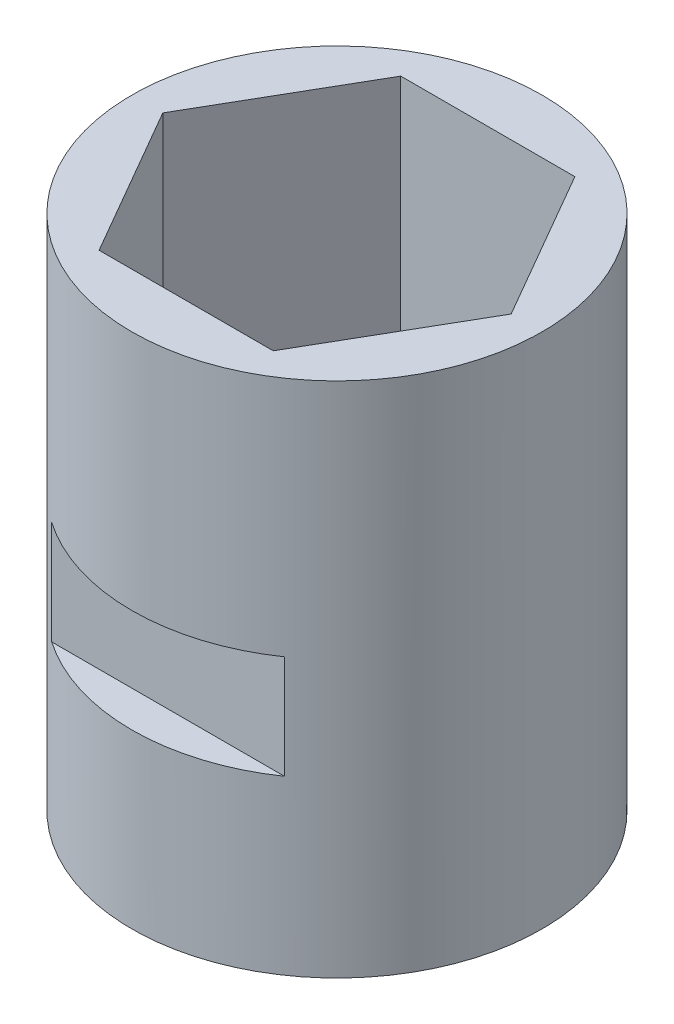
ISO-10303-21;
HEADER;
FILE_DESCRIPTION(('STEP AP214'),'2;1');
FILE_NAME('part.step','',(''),(''),'','','');
FILE_SCHEMA(('AUTOMOTIVE_DESIGN { 1 0 10303 214 1 1 1 1 }'));
ENDSEC;
DATA;
#1=APPLICATION_CONTEXT('core data for automotive mechanical design processes');
#2=APPLICATION_PROTOCOL_DEFINITION('international standard','automotive_design',2000,#1);
#3=PRODUCT_CONTEXT('',#1,'mechanical');
#4=PRODUCT('Part','Part','',(#3));
#5=PRODUCT_RELATED_PRODUCT_CATEGORY('part','',(#4));
#6=PRODUCT_DEFINITION_FORMATION('','',#4);
#7=PRODUCT_DEFINITION_CONTEXT('part definition',#1,'design');
#8=PRODUCT_DEFINITION('design','',#6,#7);
#9=PRODUCT_DEFINITION_SHAPE('','',#8);
#10=(LENGTH_UNIT() NAMED_UNIT(*) SI_UNIT(.MILLI.,.METRE.));
#11=(NAMED_UNIT(*) PLANE_ANGLE_UNIT() SI_UNIT($,.RADIAN.));
#12=(NAMED_UNIT(*) SI_UNIT($,.STERADIAN.) SOLID_ANGLE_UNIT());
#13=UNCERTAINTY_MEASURE_WITH_UNIT(LENGTH_MEASURE(1.E-05),#10,'distance_accuracy_value','');
#14=(GEOMETRIC_REPRESENTATION_CONTEXT(3) GLOBAL_UNCERTAINTY_ASSIGNED_CONTEXT((#13)) GLOBAL_UNIT_ASSIGNED_CONTEXT((#10,
#11,#12)) REPRESENTATION_CONTEXT('',''));
#15=CARTESIAN_POINT('',(0.,0.,0.));
#16=DIRECTION('',(0.,0.,1.));
#17=DIRECTION('',(1.,0.,0.));
#18=AXIS2_PLACEMENT_3D('',#15,#16,#17);
#19=CARTESIAN_POINT('',(0.,15.875,0.));
#20=DIRECTION('',(0.,1.,0.));
#21=DIRECTION('',(0.,0.,1.));
#22=AXIS2_PLACEMENT_3D('',#19,#20,#21);
#23=PLANE('',#22);
#24=CARTESIAN_POINT('',(0.,15.875,0.));
#25=DIRECTION('',(0.,1.,0.));
#26=DIRECTION('',(0.,0.,1.));
#27=AXIS2_PLACEMENT_3D('',#24,#25,#26);
#28=CIRCLE('',#27,7.5565);
#29=CARTESIAN_POINT('',(0.,15.875,7.5565));
#30=VERTEX_POINT('',#29);
#31=EDGE_CURVE('E200',#30,#30,#28,.T.);
#32=ORIENTED_EDGE('',*,*,#31,.T.);
#33=EDGE_LOOP('',(#32));
#34=FACE_BOUND('',#33,.T.);
#35=DIRECTION('',(-0.5,0.,0.866025403784439));
#36=VECTOR('',#35,1.);
#37=CARTESIAN_POINT('',(-3.20790243318486,15.875,-5.55625));
#38=LINE('',#37,#36);
#39=CARTESIAN_POINT('',(-3.20790243318486,15.875,-5.55625));
#40=VERTEX_POINT('',#39);
#41=CARTESIAN_POINT('',(-6.41580486636972,15.875,0.));
#42=VERTEX_POINT('',#41);
#43=EDGE_CURVE('E159',#40,#42,#38,.T.);
#44=ORIENTED_EDGE('',*,*,#43,.F.);
#45=DIRECTION('',(-1.,0.,0.));
#46=VECTOR('',#45,1.);
#47=CARTESIAN_POINT('',(3.20790243318486,15.875,-5.55625));
#48=LINE('',#47,#46);
#49=CARTESIAN_POINT('',(3.20790243318486,15.875,-5.55625));
#50=VERTEX_POINT('',#49);
#51=EDGE_CURVE('E157',#50,#40,#48,.T.);
#52=ORIENTED_EDGE('',*,*,#51,.F.);
#53=DIRECTION('',(-0.5,0.,-0.866025403784439));
#54=VECTOR('',#53,1.);
#55=CARTESIAN_POINT('',(6.41580486636972,15.875,0.));
#56=LINE('',#55,#54);
#57=CARTESIAN_POINT('',(6.41580486636972,15.875,0.));
#58=VERTEX_POINT('',#57);
#59=EDGE_CURVE('E169',#58,#50,#56,.T.);
#60=ORIENTED_EDGE('',*,*,#59,.F.);
#61=DIRECTION('',(0.5,0.,-0.866025403784439));
#62=VECTOR('',#61,1.);
#63=CARTESIAN_POINT('',(3.20790243318486,15.875,5.55625));
#64=LINE('',#63,#62);
#65=CARTESIAN_POINT('',(3.20790243318486,15.875,5.55625));
#66=VERTEX_POINT('',#65);
#67=EDGE_CURVE('E166',#66,#58,#64,.T.);
#68=ORIENTED_EDGE('',*,*,#67,.F.);
#69=DIRECTION('',(1.,0.,0.));
#70=VECTOR('',#69,1.);
#71=CARTESIAN_POINT('',(-3.20790243318486,15.875,5.55625));
#72=LINE('',#71,#70);
#73=CARTESIAN_POINT('',(-3.20790243318486,15.875,5.55625));
#74=VERTEX_POINT('',#73);
#75=EDGE_CURVE('E164',#74,#66,#72,.T.);
#76=ORIENTED_EDGE('',*,*,#75,.F.);
#77=DIRECTION('',(0.5,0.,0.866025403784439));
#78=VECTOR('',#77,1.);
#79=CARTESIAN_POINT('',(-6.41580486636972,15.875,0.));
#80=LINE('',#79,#78);
#81=EDGE_CURVE('E162',#42,#74,#80,.T.);
#82=ORIENTED_EDGE('',*,*,#81,.F.);
#83=EDGE_LOOP('',(#44,#52,#60,#68,#76,#82));
#84=FACE_BOUND('',#83,.T.);
#85=ADVANCED_FACE('F34',(#34,#84),#23,.T.);
#86=CARTESIAN_POINT('',(0.,15.875,0.));
#87=DIRECTION('',(0.,-1.,0.));
#88=DIRECTION('',(0.,0.,-1.));
#89=AXIS2_PLACEMENT_3D('',#86,#87,#88);
#90=CYLINDRICAL_SURFACE('',#89,7.5565);
#91=DIRECTION('',(0.,-1.,0.));
#92=VECTOR('',#91,1.);
#93=CARTESIAN_POINT('',(-4.28660276326136,15.875,6.22300000000001));
#94=LINE('',#93,#92);
#95=CARTESIAN_POINT('',(-4.28660276326137,3.175,6.223));
#96=VERTEX_POINT('',#95);
#97=CARTESIAN_POINT('',(-4.28660276326136,6.985,6.223));
#98=VERTEX_POINT('',#97);
#99=EDGE_CURVE('E129',#96,#98,#94,.F.);
#100=ORIENTED_EDGE('',*,*,#99,.T.);
#101=CARTESIAN_POINT('',(0.,6.985,0.));
#102=DIRECTION('',(0.,1.,0.));
#103=DIRECTION('',(0.,0.,1.));
#104=AXIS2_PLACEMENT_3D('',#101,#102,#103);
#105=CIRCLE('',#104,7.5565);
#106=CARTESIAN_POINT('',(4.28660276326136,6.985,6.223));
#107=VERTEX_POINT('',#106);
#108=EDGE_CURVE('E11',#98,#107,#105,.T.);
#109=ORIENTED_EDGE('',*,*,#108,.T.);
#110=DIRECTION('',(0.,-1.,0.));
#111=VECTOR('',#110,1.);
#112=CARTESIAN_POINT('',(4.28660276326136,15.875,6.22300000000001));
#113=LINE('',#112,#111);
#114=CARTESIAN_POINT('',(4.28660276326137,3.175,6.223));
#115=VERTEX_POINT('',#114);
#116=EDGE_CURVE('E42',#107,#115,#113,.T.);
#117=ORIENTED_EDGE('',*,*,#116,.T.);
#118=CARTESIAN_POINT('',(0.,3.175,0.));
#119=DIRECTION('',(0.,-1.,0.));
#120=DIRECTION('',(0.,0.,-1.));
#121=AXIS2_PLACEMENT_3D('',#118,#119,#120);
#122=CIRCLE('',#121,7.5565);
#123=EDGE_CURVE('E126',#115,#96,#122,.T.);
#124=ORIENTED_EDGE('',*,*,#123,.T.);
#125=EDGE_LOOP('',(#100,#109,#117,#124));
#126=FACE_BOUND('',#125,.T.);
#127=CARTESIAN_POINT('',(0.,6.985,0.));
#128=DIRECTION('',(0.,1.,0.));
#129=DIRECTION('',(0.,0.,1.));
#130=AXIS2_PLACEMENT_3D('',#127,#128,#129);
#131=CIRCLE('',#130,7.5565);
#132=CARTESIAN_POINT('',(4.28660276326137,6.985,-6.223));
#133=VERTEX_POINT('',#132);
#134=CARTESIAN_POINT('',(-4.28660276326137,6.985,-6.223));
#135=VERTEX_POINT('',#134);
#136=EDGE_CURVE('E118',#133,#135,#131,.T.);
#137=ORIENTED_EDGE('',*,*,#136,.T.);
#138=DIRECTION('',(0.,-1.,0.));
#139=VECTOR('',#138,1.);
#140=CARTESIAN_POINT('',(-4.28660276326137,15.875,-6.223));
#141=LINE('',#140,#139);
#142=CARTESIAN_POINT('',(-4.28660276326137,3.175,-6.223));
#143=VERTEX_POINT('',#142);
#144=EDGE_CURVE('E122',#135,#143,#141,.T.);
#145=ORIENTED_EDGE('',*,*,#144,.T.);
#146=CARTESIAN_POINT('',(0.,3.175,0.));
#147=DIRECTION('',(0.,-1.,0.));
#148=DIRECTION('',(0.,0.,-1.));
#149=AXIS2_PLACEMENT_3D('',#146,#147,#148);
#150=CIRCLE('',#149,7.5565);
#151=CARTESIAN_POINT('',(4.28660276326137,3.175,-6.223));
#152=VERTEX_POINT('',#151);
#153=EDGE_CURVE('E111',#143,#152,#150,.T.);
#154=ORIENTED_EDGE('',*,*,#153,.T.);
#155=DIRECTION('',(0.,-1.,0.));
#156=VECTOR('',#155,1.);
#157=CARTESIAN_POINT('',(4.28660276326137,15.875,-6.223));
#158=LINE('',#157,#156);
#159=EDGE_CURVE('E119',#152,#133,#158,.F.);
#160=ORIENTED_EDGE('',*,*,#159,.T.);
#161=EDGE_LOOP('',(#137,#145,#154,#160));
#162=FACE_BOUND('',#161,.T.);
#163=ORIENTED_EDGE('',*,*,#31,.F.);
#164=EDGE_LOOP('',(#163));
#165=FACE_BOUND('',#164,.T.);
#166=CARTESIAN_POINT('',(0.,-3.175,0.));
#167=DIRECTION('',(0.,-1.,0.));
#168=DIRECTION('',(0.,0.,-1.));
#169=AXIS2_PLACEMENT_3D('',#166,#167,#168);
#170=CIRCLE('',#169,7.5565);
#171=CARTESIAN_POINT('',(0.,-3.175,-7.5565));
#172=VERTEX_POINT('',#171);
#173=EDGE_CURVE('E152',#172,#172,#170,.T.);
#174=ORIENTED_EDGE('',*,*,#173,.F.);
#175=EDGE_LOOP('',(#174));
#176=FACE_BOUND('',#175,.T.);
#177=ADVANCED_FACE('F36',(#126,#162,#165,#176),#90,.T.);
#178=CARTESIAN_POINT('',(3.20790243318486,15.875,-5.55625));
#179=DIRECTION('',(0.,0.,1.));
#180=DIRECTION('',(1.,0.,0.));
#181=AXIS2_PLACEMENT_3D('',#178,#179,#180);
#182=PLANE('',#181);
#183=DIRECTION('',(-1.,0.,0.));
#184=VECTOR('',#183,1.);
#185=CARTESIAN_POINT('',(3.20790243318486,0.,-5.55625));
#186=LINE('',#185,#184);
#187=CARTESIAN_POINT('',(3.20790243318486,0.,-5.55625));
#188=VERTEX_POINT('',#187);
#189=CARTESIAN_POINT('',(-3.20790243318486,0.,-5.55625));
#190=VERTEX_POINT('',#189);
#191=EDGE_CURVE('E156',#188,#190,#186,.T.);
#192=ORIENTED_EDGE('',*,*,#191,.F.);
#193=DIRECTION('',(0.,-1.,0.));
#194=VECTOR('',#193,1.);
#195=CARTESIAN_POINT('',(3.20790243318486,15.875,-5.55625));
#196=LINE('',#195,#194);
#197=EDGE_CURVE('E171',#50,#188,#196,.T.);
#198=ORIENTED_EDGE('',*,*,#197,.F.);
#199=ORIENTED_EDGE('',*,*,#51,.T.);
#200=DIRECTION('',(0.,-1.,0.));
#201=VECTOR('',#200,1.);
#202=CARTESIAN_POINT('',(-3.20790243318486,15.875,-5.55625));
#203=LINE('',#202,#201);
#204=EDGE_CURVE('E197',#40,#190,#203,.T.);
#205=ORIENTED_EDGE('',*,*,#204,.T.);
#206=EDGE_LOOP('',(#192,#198,#199,#205));
#207=FACE_BOUND('',#206,.T.);
#208=ADVANCED_FACE('F208',(#207),#182,.T.);
#209=CARTESIAN_POINT('',(-3.20790243318486,15.875,-5.55625));
#210=DIRECTION('',(0.866025403784439,0.,0.5));
#211=DIRECTION('',(0.5,0.,-0.866025403784439));
#212=AXIS2_PLACEMENT_3D('',#209,#210,#211);
#213=PLANE('',#212);
#214=DIRECTION('',(-0.5,0.,0.866025403784439));
#215=VECTOR('',#214,1.);
#216=CARTESIAN_POINT('',(-3.20790243318486,0.,-5.55625));
#217=LINE('',#216,#215);
#218=CARTESIAN_POINT('',(-6.41580486636972,0.,0.));
#219=VERTEX_POINT('',#218);
#220=EDGE_CURVE('E174',#190,#219,#217,.T.);
#221=ORIENTED_EDGE('',*,*,#220,.F.);
#222=ORIENTED_EDGE('',*,*,#204,.F.);
#223=ORIENTED_EDGE('',*,*,#43,.T.);
#224=DIRECTION('',(0.,-1.,0.));
#225=VECTOR('',#224,1.);
#226=CARTESIAN_POINT('',(-6.41580486636972,15.875,0.));
#227=LINE('',#226,#225);
#228=EDGE_CURVE('E195',#42,#219,#227,.T.);
#229=ORIENTED_EDGE('',*,*,#228,.T.);
#230=EDGE_LOOP('',(#221,#222,#223,#229));
#231=FACE_BOUND('',#230,.T.);
#232=ADVANCED_FACE('F240',(#231),#213,.T.);
#233=CARTESIAN_POINT('',(-6.41580486636972,15.875,0.));
#234=DIRECTION('',(0.866025403784439,0.,-0.5));
#235=DIRECTION('',(-0.5,0.,-0.866025403784439));
#236=AXIS2_PLACEMENT_3D('',#233,#234,#235);
#237=PLANE('',#236);
#238=DIRECTION('',(0.5,0.,0.866025403784439));
#239=VECTOR('',#238,1.);
#240=CARTESIAN_POINT('',(-6.41580486636972,0.,0.));
#241=LINE('',#240,#239);
#242=CARTESIAN_POINT('',(-3.20790243318486,0.,5.55625));
#243=VERTEX_POINT('',#242);
#244=EDGE_CURVE('E177',#219,#243,#241,.T.);
#245=ORIENTED_EDGE('',*,*,#244,.F.);
#246=ORIENTED_EDGE('',*,*,#228,.F.);
#247=ORIENTED_EDGE('',*,*,#81,.T.);
#248=DIRECTION('',(0.,-1.,0.));
#249=VECTOR('',#248,1.);
#250=CARTESIAN_POINT('',(-3.20790243318486,15.875,5.55625));
#251=LINE('',#250,#249);
#252=EDGE_CURVE('E193',#74,#243,#251,.T.);
#253=ORIENTED_EDGE('',*,*,#252,.T.);
#254=EDGE_LOOP('',(#245,#246,#247,#253));
#255=FACE_BOUND('',#254,.T.);
#256=ADVANCED_FACE('F248',(#255),#237,.T.);
#257=CARTESIAN_POINT('',(-3.20790243318486,15.875,5.55625));
#258=DIRECTION('',(0.,0.,-1.));
#259=DIRECTION('',(-1.,0.,0.));
#260=AXIS2_PLACEMENT_3D('',#257,#258,#259);
#261=PLANE('',#260);
#262=DIRECTION('',(1.,0.,0.));
#263=VECTOR('',#262,1.);
#264=CARTESIAN_POINT('',(-3.20790243318486,0.,5.55625));
#265=LINE('',#264,#263);
#266=CARTESIAN_POINT('',(3.20790243318486,0.,5.55625));
#267=VERTEX_POINT('',#266);
#268=EDGE_CURVE('E180',#243,#267,#265,.T.);
#269=ORIENTED_EDGE('',*,*,#268,.F.);
#270=ORIENTED_EDGE('',*,*,#252,.F.);
#271=ORIENTED_EDGE('',*,*,#75,.T.);
#272=DIRECTION('',(0.,-1.,0.));
#273=VECTOR('',#272,1.);
#274=CARTESIAN_POINT('',(3.20790243318486,15.875,5.55625));
#275=LINE('',#274,#273);
#276=EDGE_CURVE('E191',#66,#267,#275,.T.);
#277=ORIENTED_EDGE('',*,*,#276,.T.);
#278=EDGE_LOOP('',(#269,#270,#271,#277));
#279=FACE_BOUND('',#278,.T.);
#280=ADVANCED_FACE('F251',(#279),#261,.T.);
#281=CARTESIAN_POINT('',(3.20790243318486,15.875,5.55625));
#282=DIRECTION('',(-0.866025403784439,0.,-0.5));
#283=DIRECTION('',(-0.5,0.,0.866025403784439));
#284=AXIS2_PLACEMENT_3D('',#281,#282,#283);
#285=PLANE('',#284);
#286=DIRECTION('',(0.5,0.,-0.866025403784439));
#287=VECTOR('',#286,1.);
#288=CARTESIAN_POINT('',(3.20790243318486,0.,5.55625));
#289=LINE('',#288,#287);
#290=CARTESIAN_POINT('',(6.41580486636972,0.,0.));
#291=VERTEX_POINT('',#290);
#292=EDGE_CURVE('E183',#267,#291,#289,.T.);
#293=ORIENTED_EDGE('',*,*,#292,.F.);
#294=ORIENTED_EDGE('',*,*,#276,.F.);
#295=ORIENTED_EDGE('',*,*,#67,.T.);
#296=DIRECTION('',(0.,-1.,0.));
#297=VECTOR('',#296,1.);
#298=CARTESIAN_POINT('',(6.41580486636972,15.875,0.));
#299=LINE('',#298,#297);
#300=EDGE_CURVE('E189',#58,#291,#299,.T.);
#301=ORIENTED_EDGE('',*,*,#300,.T.);
#302=EDGE_LOOP('',(#293,#294,#295,#301));
#303=FACE_BOUND('',#302,.T.);
#304=ADVANCED_FACE('F254',(#303),#285,.T.);
#305=CARTESIAN_POINT('',(6.41580486636972,15.875,0.));
#306=DIRECTION('',(-0.866025403784439,0.,0.5));
#307=DIRECTION('',(0.5,0.,0.866025403784439));
#308=AXIS2_PLACEMENT_3D('',#305,#306,#307);
#309=PLANE('',#308);
#310=DIRECTION('',(-0.5,0.,-0.866025403784439));
#311=VECTOR('',#310,1.);
#312=CARTESIAN_POINT('',(6.41580486636972,0.,0.));
#313=LINE('',#312,#311);
#314=EDGE_CURVE('E160',#291,#188,#313,.T.);
#315=ORIENTED_EDGE('',*,*,#314,.F.);
#316=ORIENTED_EDGE('',*,*,#300,.F.);
#317=ORIENTED_EDGE('',*,*,#59,.T.);
#318=ORIENTED_EDGE('',*,*,#197,.T.);
#319=EDGE_LOOP('',(#315,#316,#317,#318));
#320=FACE_BOUND('',#319,.T.);
#321=ADVANCED_FACE('F227',(#320),#309,.T.);
#322=CARTESIAN_POINT('',(0.,0.,0.));
#323=DIRECTION('',(0.,-1.,0.));
#324=DIRECTION('',(0.,0.,-1.));
#325=AXIS2_PLACEMENT_3D('',#322,#323,#324);
#326=PLANE('',#325);
#327=CARTESIAN_POINT('',(0.,0.,0.));
#328=DIRECTION('',(0.,-1.,0.));
#329=DIRECTION('',(0.,0.,-1.));
#330=AXIS2_PLACEMENT_3D('',#327,#328,#329);
#331=CIRCLE('',#330,3.3782);
#332=CARTESIAN_POINT('',(0.,0.,-3.3782));
#333=VERTEX_POINT('',#332);
#334=EDGE_CURVE('E143',#333,#333,#331,.T.);
#335=ORIENTED_EDGE('',*,*,#334,.T.);
#336=EDGE_LOOP('',(#335));
#337=FACE_BOUND('',#336,.T.);
#338=ORIENTED_EDGE('',*,*,#314,.T.);
#339=ORIENTED_EDGE('',*,*,#191,.T.);
#340=ORIENTED_EDGE('',*,*,#220,.T.);
#341=ORIENTED_EDGE('',*,*,#244,.T.);
#342=ORIENTED_EDGE('',*,*,#268,.T.);
#343=ORIENTED_EDGE('',*,*,#292,.T.);
#344=EDGE_LOOP('',(#338,#339,#340,#341,#342,#343));
#345=FACE_BOUND('',#344,.T.);
#346=ADVANCED_FACE('F215',(#337,#345),#326,.F.);
#347=CARTESIAN_POINT('',(0.,-3.175,0.));
#348=DIRECTION('',(0.,-1.,0.));
#349=DIRECTION('',(0.,0.,-1.));
#350=AXIS2_PLACEMENT_3D('',#347,#348,#349);
#351=PLANE('',#350);
#352=ORIENTED_EDGE('',*,*,#173,.T.);
#353=EDGE_LOOP('',(#352));
#354=FACE_BOUND('',#353,.T.);
#355=CARTESIAN_POINT('',(0.,-3.175,0.));
#356=DIRECTION('',(0.,-1.,0.));
#357=DIRECTION('',(0.,0.,-1.));
#358=AXIS2_PLACEMENT_3D('',#355,#356,#357);
#359=CIRCLE('',#358,3.3782);
#360=CARTESIAN_POINT('',(0.,-3.175,-3.3782));
#361=VERTEX_POINT('',#360);
#362=EDGE_CURVE('E146',#361,#361,#359,.T.);
#363=ORIENTED_EDGE('',*,*,#362,.F.);
#364=EDGE_LOOP('',(#363));
#365=FACE_BOUND('',#364,.T.);
#366=ADVANCED_FACE('F211',(#354,#365),#351,.T.);
#367=CARTESIAN_POINT('',(0.,-3.175,0.));
#368=DIRECTION('',(0.,1.,0.));
#369=DIRECTION('',(0.,0.,1.));
#370=AXIS2_PLACEMENT_3D('',#367,#368,#369);
#371=CYLINDRICAL_SURFACE('',#370,3.3782);
#372=ORIENTED_EDGE('',*,*,#362,.T.);
#373=EDGE_LOOP('',(#372));
#374=FACE_BOUND('',#373,.T.);
#375=ORIENTED_EDGE('',*,*,#334,.F.);
#376=EDGE_LOOP('',(#375));
#377=FACE_BOUND('',#376,.T.);
#378=ADVANCED_FACE('F214',(#374,#377),#371,.F.);
#379=CARTESIAN_POINT('',(-7.5565,6.985,-6.223));
#380=DIRECTION('',(0.,1.,0.));
#381=DIRECTION('',(0.,0.,1.));
#382=AXIS2_PLACEMENT_3D('',#379,#380,#381);
#383=PLANE('',#382);
#384=DIRECTION('',(1.,0.,0.));
#385=VECTOR('',#384,1.);
#386=CARTESIAN_POINT('',(-7.5565,6.985,-6.223));
#387=LINE('',#386,#385);
#388=EDGE_CURVE('E56',#135,#133,#387,.T.);
#389=ORIENTED_EDGE('',*,*,#388,.F.);
#390=ORIENTED_EDGE('',*,*,#136,.F.);
#391=EDGE_LOOP('',(#389,#390));
#392=FACE_BOUND('',#391,.T.);
#393=ADVANCED_FACE('F221',(#392),#383,.F.);
#394=CARTESIAN_POINT('',(-7.5565,3.175,-8.47905548205234));
#395=DIRECTION('',(0.,-1.,0.));
#396=DIRECTION('',(0.,0.,-1.));
#397=AXIS2_PLACEMENT_3D('',#394,#395,#396);
#398=PLANE('',#397);
#399=DIRECTION('',(1.,0.,0.));
#400=VECTOR('',#399,1.);
#401=CARTESIAN_POINT('',(-7.5565,3.175,-6.223));
#402=LINE('',#401,#400);
#403=EDGE_CURVE('E114',#143,#152,#402,.T.);
#404=ORIENTED_EDGE('',*,*,#403,.T.);
#405=ORIENTED_EDGE('',*,*,#153,.F.);
#406=EDGE_LOOP('',(#404,#405));
#407=FACE_BOUND('',#406,.T.);
#408=ADVANCED_FACE('F113',(#407),#398,.F.);
#409=CARTESIAN_POINT('',(-7.5565,6.985,-6.223));
#410=DIRECTION('',(0.,0.,1.));
#411=DIRECTION('',(1.,0.,0.));
#412=AXIS2_PLACEMENT_3D('',#409,#410,#411);
#413=PLANE('',#412);
#414=ORIENTED_EDGE('',*,*,#388,.T.);
#415=ORIENTED_EDGE('',*,*,#159,.F.);
#416=ORIENTED_EDGE('',*,*,#403,.F.);
#417=ORIENTED_EDGE('',*,*,#144,.F.);
#418=EDGE_LOOP('',(#414,#415,#416,#417));
#419=FACE_BOUND('',#418,.T.);
#420=ADVANCED_FACE('F121',(#419),#413,.F.);
#421=CARTESIAN_POINT('',(-7.5565,6.985,6.223));
#422=DIRECTION('',(0.,1.,0.));
#423=DIRECTION('',(0.,0.,1.));
#424=AXIS2_PLACEMENT_3D('',#421,#422,#423);
#425=PLANE('',#424);
#426=DIRECTION('',(1.,0.,0.));
#427=VECTOR('',#426,1.);
#428=CARTESIAN_POINT('',(-7.5565,6.985,6.223));
#429=LINE('',#428,#427);
#430=EDGE_CURVE('E140',#98,#107,#429,.T.);
#431=ORIENTED_EDGE('',*,*,#430,.T.);
#432=ORIENTED_EDGE('',*,*,#108,.F.);
#433=EDGE_LOOP('',(#431,#432));
#434=FACE_BOUND('',#433,.T.);
#435=ADVANCED_FACE('F142',(#434),#425,.F.);
#436=CARTESIAN_POINT('',(-7.5565,6.985,6.223));
#437=DIRECTION('',(0.,0.,-1.));
#438=DIRECTION('',(0.,1.,0.));
#439=AXIS2_PLACEMENT_3D('',#436,#437,#438);
#440=PLANE('',#439);
#441=ORIENTED_EDGE('',*,*,#430,.F.);
#442=ORIENTED_EDGE('',*,*,#99,.F.);
#443=DIRECTION('',(1.,0.,0.));
#444=VECTOR('',#443,1.);
#445=CARTESIAN_POINT('',(-7.5565,3.175,6.223));
#446=LINE('',#445,#444);
#447=EDGE_CURVE('E48',#96,#115,#446,.T.);
#448=ORIENTED_EDGE('',*,*,#447,.T.);
#449=ORIENTED_EDGE('',*,*,#116,.F.);
#450=EDGE_LOOP('',(#441,#442,#448,#449));
#451=FACE_BOUND('',#450,.T.);
#452=ADVANCED_FACE('F139',(#451),#440,.F.);
#453=CARTESIAN_POINT('',(-7.5565,3.175,8.20200981711855));
#454=DIRECTION('',(0.,-1.,0.));
#455=DIRECTION('',(0.,0.,-1.));
#456=AXIS2_PLACEMENT_3D('',#453,#454,#455);
#457=PLANE('',#456);
#458=ORIENTED_EDGE('',*,*,#447,.F.);
#459=ORIENTED_EDGE('',*,*,#123,.F.);
#460=EDGE_LOOP('',(#458,#459));
#461=FACE_BOUND('',#460,.T.);
#462=ADVANCED_FACE('F357',(#461),#457,.F.);
#463=CLOSED_SHELL('',(#85,#177,#208,#232,#256,#280,#304,#321,#346,#366,#378,#393,#408,#420,#435,
#452,#462));
#464=MANIFOLD_SOLID_BREP('B2',#463);
#465=ADVANCED_BREP_SHAPE_REPRESENTATION('',(#18,#464),#14);
#466=SHAPE_DEFINITION_REPRESENTATION(#9,#465);
ENDSEC;
END-ISO-10303-21;
